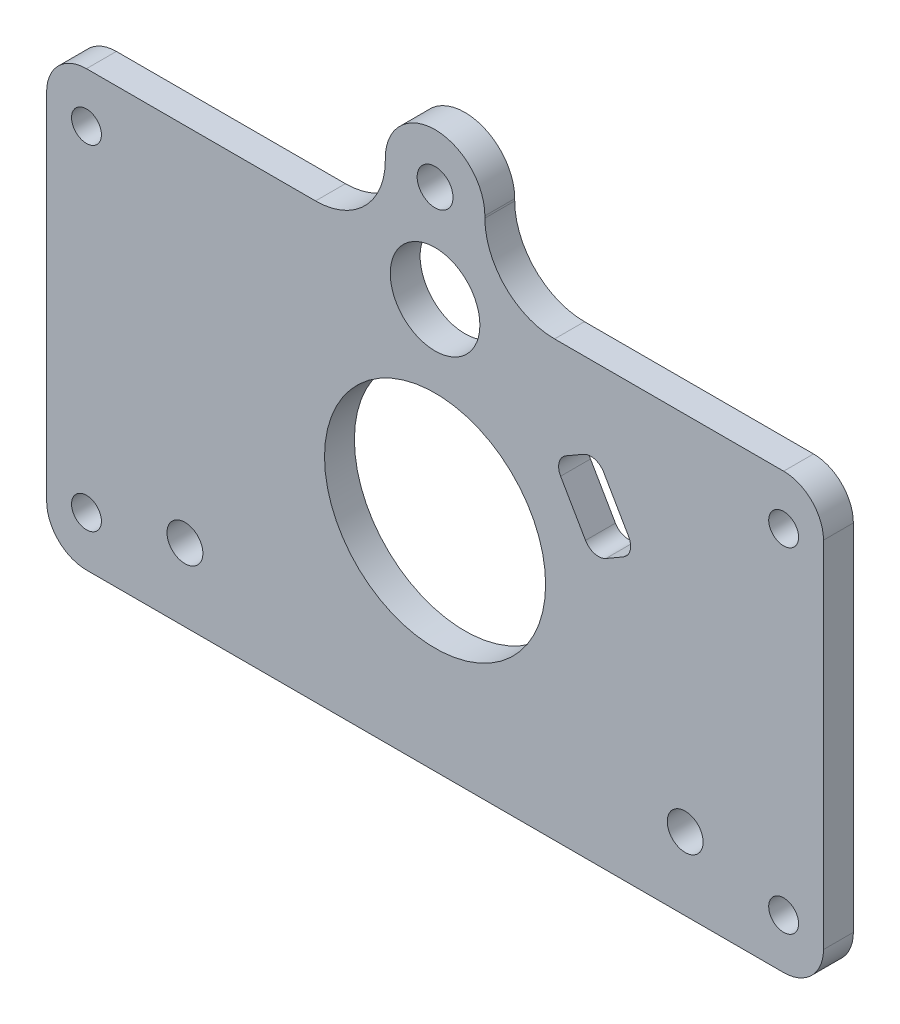
ISO-10303-21;
HEADER;
FILE_DESCRIPTION(('STEP AP214'),'2;1');
FILE_NAME('part.step','',(''),(''),'','','');
FILE_SCHEMA(('AUTOMOTIVE_DESIGN { 1 0 10303 214 1 1 1 1 }'));
ENDSEC;
DATA;
#1=APPLICATION_CONTEXT('core data for automotive mechanical design processes');
#2=APPLICATION_PROTOCOL_DEFINITION('international standard','automotive_design',2000,#1);
#3=PRODUCT_CONTEXT('',#1,'mechanical');
#4=PRODUCT('Part','Part','',(#3));
#5=PRODUCT_RELATED_PRODUCT_CATEGORY('part','',(#4));
#6=PRODUCT_DEFINITION_FORMATION('','',#4);
#7=PRODUCT_DEFINITION_CONTEXT('part definition',#1,'design');
#8=PRODUCT_DEFINITION('design','',#6,#7);
#9=PRODUCT_DEFINITION_SHAPE('','',#8);
#10=(LENGTH_UNIT() NAMED_UNIT(*) SI_UNIT(.MILLI.,.METRE.));
#11=(NAMED_UNIT(*) PLANE_ANGLE_UNIT() SI_UNIT($,.RADIAN.));
#12=(NAMED_UNIT(*) SI_UNIT($,.STERADIAN.) SOLID_ANGLE_UNIT());
#13=UNCERTAINTY_MEASURE_WITH_UNIT(LENGTH_MEASURE(1.E-05),#10,'distance_accuracy_value','');
#14=(GEOMETRIC_REPRESENTATION_CONTEXT(3) GLOBAL_UNCERTAINTY_ASSIGNED_CONTEXT((#13)) GLOBAL_UNIT_ASSIGNED_CONTEXT((#10,
#11,#12)) REPRESENTATION_CONTEXT('',''));
#15=CARTESIAN_POINT('',(0.,0.,0.));
#16=DIRECTION('',(0.,0.,1.));
#17=DIRECTION('',(1.,0.,0.));
#18=AXIS2_PLACEMENT_3D('',#15,#16,#17);
#19=CARTESIAN_POINT('',(0.,29.,3.));
#20=DIRECTION('',(0.,0.,-1.));
#21=DIRECTION('',(-1.,0.,0.));
#22=AXIS2_PLACEMENT_3D('',#19,#20,#21);
#23=PLANE('',#22);
#24=CARTESIAN_POINT('',(-35.,-16.8,3.));
#25=DIRECTION('',(0.,0.,1.));
#26=DIRECTION('',(1.,0.,0.));
#27=AXIS2_PLACEMENT_3D('',#24,#25,#26);
#28=CIRCLE('',#27,1.5);
#29=CARTESIAN_POINT('',(-33.5,-16.8,3.));
#30=VERTEX_POINT('',#29);
#31=EDGE_CURVE('E389',#30,#30,#28,.T.);
#32=ORIENTED_EDGE('',*,*,#31,.F.);
#33=EDGE_LOOP('',(#32));
#34=FACE_BOUND('',#33,.T.);
#35=CARTESIAN_POINT('',(-35.,16.8,3.));
#36=DIRECTION('',(0.,0.,1.));
#37=DIRECTION('',(1.,0.,0.));
#38=AXIS2_PLACEMENT_3D('',#35,#36,#37);
#39=CIRCLE('',#38,1.5);
#40=CARTESIAN_POINT('',(-33.5,16.8,3.));
#41=VERTEX_POINT('',#40);
#42=EDGE_CURVE('E385',#41,#41,#39,.T.);
#43=ORIENTED_EDGE('',*,*,#42,.F.);
#44=EDGE_LOOP('',(#43));
#45=FACE_BOUND('',#44,.T.);
#46=CARTESIAN_POINT('',(35.,-16.8,3.));
#47=DIRECTION('',(0.,0.,1.));
#48=DIRECTION('',(1.,0.,0.));
#49=AXIS2_PLACEMENT_3D('',#46,#47,#48);
#50=CIRCLE('',#49,1.5);
#51=CARTESIAN_POINT('',(36.5,-16.8,3.));
#52=VERTEX_POINT('',#51);
#53=EDGE_CURVE('E376',#52,#52,#50,.T.);
#54=ORIENTED_EDGE('',*,*,#53,.F.);
#55=EDGE_LOOP('',(#54));
#56=FACE_BOUND('',#55,.T.);
#57=CARTESIAN_POINT('',(35.,16.8,3.));
#58=DIRECTION('',(0.,0.,1.));
#59=DIRECTION('',(1.,0.,0.));
#60=AXIS2_PLACEMENT_3D('',#57,#58,#59);
#61=CIRCLE('',#60,1.5);
#62=CARTESIAN_POINT('',(36.5,16.8,3.));
#63=VERTEX_POINT('',#62);
#64=EDGE_CURVE('E367',#63,#63,#61,.T.);
#65=ORIENTED_EDGE('',*,*,#64,.F.);
#66=EDGE_LOOP('',(#65));
#67=FACE_BOUND('',#66,.T.);
#68=CARTESIAN_POINT('',(0.,0.,3.));
#69=DIRECTION('',(0.,0.,1.));
#70=DIRECTION('',(1.,0.,0.));
#71=AXIS2_PLACEMENT_3D('',#68,#69,#70);
#72=CIRCLE('',#71,11.1);
#73=CARTESIAN_POINT('',(11.1,0.,3.));
#74=VERTEX_POINT('',#73);
#75=EDGE_CURVE('E365',#74,#74,#72,.T.);
#76=ORIENTED_EDGE('',*,*,#75,.F.);
#77=EDGE_LOOP('',(#76));
#78=FACE_BOUND('',#77,.T.);
#79=CARTESIAN_POINT('',(0.,19.25,3.));
#80=DIRECTION('',(0.,0.,1.));
#81=DIRECTION('',(1.,0.,0.));
#82=AXIS2_PLACEMENT_3D('',#79,#80,#81);
#83=CIRCLE('',#82,4.5);
#84=CARTESIAN_POINT('',(4.5,19.25,3.));
#85=VERTEX_POINT('',#84);
#86=EDGE_CURVE('E227',#85,#85,#83,.T.);
#87=ORIENTED_EDGE('',*,*,#86,.F.);
#88=EDGE_LOOP('',(#87));
#89=FACE_BOUND('',#88,.T.);
#90=DIRECTION('',(0.,1.,0.));
#91=VECTOR('',#90,1.);
#92=CARTESIAN_POINT('',(38.9999999999998,-21.8000000000003,3.));
#93=LINE('',#92,#91);
#94=CARTESIAN_POINT('',(38.9999999999998,-17.8000000000003,3.));
#95=VERTEX_POINT('',#94);
#96=CARTESIAN_POINT('',(38.9999999999998,17.8000000000003,3.));
#97=VERTEX_POINT('',#96);
#98=EDGE_CURVE('E353',#95,#97,#93,.T.);
#99=ORIENTED_EDGE('',*,*,#98,.T.);
#100=CARTESIAN_POINT('',(34.9999999999998,17.8000000000003,3.));
#101=DIRECTION('',(0.,0.,-1.));
#102=DIRECTION('',(-1.,0.,0.));
#103=AXIS2_PLACEMENT_3D('',#100,#101,#102);
#104=CIRCLE('',#103,4.);
#105=CARTESIAN_POINT('',(34.9999999999998,21.8000000000003,3.));
#106=VERTEX_POINT('',#105);
#107=EDGE_CURVE('E318',#97,#106,#104,.F.);
#108=ORIENTED_EDGE('',*,*,#107,.T.);
#109=DIRECTION('',(-1.,0.,0.));
#110=VECTOR('',#109,1.);
#111=CARTESIAN_POINT('',(5.,21.8000000000003,3.));
#112=LINE('',#111,#110);
#113=CARTESIAN_POINT('',(12.,21.8000000000003,3.));
#114=VERTEX_POINT('',#113);
#115=EDGE_CURVE('E205',#106,#114,#112,.T.);
#116=ORIENTED_EDGE('',*,*,#115,.T.);
#117=CARTESIAN_POINT('',(12.,28.8000000000003,3.));
#118=DIRECTION('',(0.,0.,-1.));
#119=DIRECTION('',(-1.,0.,0.));
#120=AXIS2_PLACEMENT_3D('',#117,#118,#119);
#121=CIRCLE('',#120,7.);
#122=CARTESIAN_POINT('',(5.,28.8000000000003,3.));
#123=VERTEX_POINT('',#122);
#124=EDGE_CURVE('E196',#114,#123,#121,.T.);
#125=ORIENTED_EDGE('',*,*,#124,.T.);
#126=DIRECTION('',(0.,1.,0.));
#127=VECTOR('',#126,1.);
#128=CARTESIAN_POINT('',(5.,29.,3.));
#129=LINE('',#128,#127);
#130=CARTESIAN_POINT('',(5.,29.,3.));
#131=VERTEX_POINT('',#130);
#132=EDGE_CURVE('E186',#123,#131,#129,.T.);
#133=ORIENTED_EDGE('',*,*,#132,.T.);
#134=CARTESIAN_POINT('',(0.,29.,3.));
#135=DIRECTION('',(0.,0.,1.));
#136=DIRECTION('',(-1.,0.,0.));
#137=AXIS2_PLACEMENT_3D('',#134,#135,#136);
#138=CIRCLE('',#137,5.);
#139=CARTESIAN_POINT('',(-5.,29.,3.));
#140=VERTEX_POINT('',#139);
#141=EDGE_CURVE('E195',#131,#140,#138,.T.);
#142=ORIENTED_EDGE('',*,*,#141,.T.);
#143=DIRECTION('',(0.,-1.,0.));
#144=VECTOR('',#143,1.);
#145=CARTESIAN_POINT('',(-5.,21.8000000000003,3.));
#146=LINE('',#145,#144);
#147=CARTESIAN_POINT('',(-5.,28.8000000000003,3.));
#148=VERTEX_POINT('',#147);
#149=EDGE_CURVE('E220',#140,#148,#146,.T.);
#150=ORIENTED_EDGE('',*,*,#149,.T.);
#151=CARTESIAN_POINT('',(-12.,28.8000000000003,3.));
#152=DIRECTION('',(0.,0.,-1.));
#153=DIRECTION('',(-1.,0.,0.));
#154=AXIS2_PLACEMENT_3D('',#151,#152,#153);
#155=CIRCLE('',#154,7.);
#156=CARTESIAN_POINT('',(-12.,21.8000000000003,3.));
#157=VERTEX_POINT('',#156);
#158=EDGE_CURVE('E292',#148,#157,#155,.T.);
#159=ORIENTED_EDGE('',*,*,#158,.T.);
#160=DIRECTION('',(-1.,0.,0.));
#161=VECTOR('',#160,1.);
#162=CARTESIAN_POINT('',(-38.9999999999998,21.8000000000003,3.));
#163=LINE('',#162,#161);
#164=CARTESIAN_POINT('',(-34.9999999999998,21.8000000000003,3.));
#165=VERTEX_POINT('',#164);
#166=EDGE_CURVE('E244',#157,#165,#163,.T.);
#167=ORIENTED_EDGE('',*,*,#166,.T.);
#168=CARTESIAN_POINT('',(-34.9999999999998,17.8000000000003,3.));
#169=DIRECTION('',(0.,0.,-1.));
#170=DIRECTION('',(-1.,0.,0.));
#171=AXIS2_PLACEMENT_3D('',#168,#169,#170);
#172=CIRCLE('',#171,4.);
#173=CARTESIAN_POINT('',(-38.9999999999998,17.8000000000003,3.));
#174=VERTEX_POINT('',#173);
#175=EDGE_CURVE('E311',#165,#174,#172,.F.);
#176=ORIENTED_EDGE('',*,*,#175,.T.);
#177=DIRECTION('',(0.,-1.,0.));
#178=VECTOR('',#177,1.);
#179=CARTESIAN_POINT('',(-38.9999999999998,-21.8000000000003,3.));
#180=LINE('',#179,#178);
#181=CARTESIAN_POINT('',(-38.9999999999998,-17.8000000000003,3.));
#182=VERTEX_POINT('',#181);
#183=EDGE_CURVE('E329',#174,#182,#180,.T.);
#184=ORIENTED_EDGE('',*,*,#183,.T.);
#185=CARTESIAN_POINT('',(-34.9999999999998,-17.8000000000003,3.));
#186=DIRECTION('',(0.,0.,-1.));
#187=DIRECTION('',(-1.,0.,0.));
#188=AXIS2_PLACEMENT_3D('',#185,#186,#187);
#189=CIRCLE('',#188,4.);
#190=CARTESIAN_POINT('',(-34.9999999999998,-21.8000000000003,3.));
#191=VERTEX_POINT('',#190);
#192=EDGE_CURVE('E65',#182,#191,#189,.F.);
#193=ORIENTED_EDGE('',*,*,#192,.T.);
#194=DIRECTION('',(1.,0.,0.));
#195=VECTOR('',#194,1.);
#196=CARTESIAN_POINT('',(-38.9999999999998,-21.8000000000003,3.));
#197=LINE('',#196,#195);
#198=CARTESIAN_POINT('',(34.9999999999998,-21.8000000000003,3.));
#199=VERTEX_POINT('',#198);
#200=EDGE_CURVE('E337',#191,#199,#197,.T.);
#201=ORIENTED_EDGE('',*,*,#200,.T.);
#202=CARTESIAN_POINT('',(34.9999999999998,-17.8000000000003,3.));
#203=DIRECTION('',(0.,0.,-1.));
#204=DIRECTION('',(-1.,0.,0.));
#205=AXIS2_PLACEMENT_3D('',#202,#203,#204);
#206=CIRCLE('',#205,4.);
#207=EDGE_CURVE('E316',#199,#95,#206,.F.);
#208=ORIENTED_EDGE('',*,*,#207,.T.);
#209=EDGE_LOOP('',(#99,#108,#116,#125,#133,#142,#150,#159,#167,#176,#184,#193,#201,#208));
#210=FACE_BOUND('',#209,.T.);
#211=DIRECTION('',(-0.866025403784441,-0.499999999999995,0.));
#212=VECTOR('',#211,1.);
#213=CARTESIAN_POINT('',(16.1865334794736,13.9641016151378,3.));
#214=LINE('',#213,#212);
#215=CARTESIAN_POINT('',(14.8874953737969,13.2141016151378,3.));
#216=VERTEX_POINT('',#215);
#217=CARTESIAN_POINT('',(13.155444566228,12.2141016151378,3.));
#218=VERTEX_POINT('',#217);
#219=EDGE_CURVE('E400',#216,#218,#214,.T.);
#220=ORIENTED_EDGE('',*,*,#219,.F.);
#221=CARTESIAN_POINT('',(15.6374953737969,11.9150635094612,3.));
#222=DIRECTION('',(0.,0.,-1.));
#223=DIRECTION('',(-1.,0.,0.));
#224=AXIS2_PLACEMENT_3D('',#221,#222,#223);
#225=CIRCLE('',#224,1.5);
#226=CARTESIAN_POINT('',(16.9365334794736,12.6650635094612,3.));
#227=VERTEX_POINT('',#226);
#228=EDGE_CURVE('E267',#216,#227,#225,.T.);
#229=ORIENTED_EDGE('',*,*,#228,.T.);
#230=DIRECTION('',(-0.499999999999995,0.866025403784442,0.));
#231=VECTOR('',#230,1.);
#232=CARTESIAN_POINT('',(20.1865334794735,7.03589838486229,3.));
#233=LINE('',#232,#231);
#234=CARTESIAN_POINT('',(19.4365334794735,8.33493649053895,3.));
#235=VERTEX_POINT('',#234);
#236=EDGE_CURVE('E391',#235,#227,#233,.T.);
#237=ORIENTED_EDGE('',*,*,#236,.F.);
#238=CARTESIAN_POINT('',(18.1374953737969,7.58493649053896,3.));
#239=DIRECTION('',(0.,0.,-1.));
#240=DIRECTION('',(-1.,0.,0.));
#241=AXIS2_PLACEMENT_3D('',#238,#239,#240);
#242=CIRCLE('',#241,1.5);
#243=CARTESIAN_POINT('',(18.8874953737969,6.2858983848623,3.));
#244=VERTEX_POINT('',#243);
#245=EDGE_CURVE('E264',#235,#244,#242,.T.);
#246=ORIENTED_EDGE('',*,*,#245,.T.);
#247=DIRECTION('',(0.866025403784441,0.499999999999995,0.));
#248=VECTOR('',#247,1.);
#249=CARTESIAN_POINT('',(15.8564064605513,4.53589838486232,3.));
#250=LINE('',#249,#248);
#251=CARTESIAN_POINT('',(17.155444566228,5.28589838486231,3.));
#252=VERTEX_POINT('',#251);
#253=EDGE_CURVE('E414',#252,#244,#250,.T.);
#254=ORIENTED_EDGE('',*,*,#253,.F.);
#255=CARTESIAN_POINT('',(16.405444566228,6.58493649053897,3.));
#256=DIRECTION('',(0.,0.,-1.));
#257=DIRECTION('',(-1.,0.,0.));
#258=AXIS2_PLACEMENT_3D('',#255,#256,#257);
#259=CIRCLE('',#258,1.5);
#260=CARTESIAN_POINT('',(15.1064064605513,5.83493649053898,3.));
#261=VERTEX_POINT('',#260);
#262=EDGE_CURVE('E280',#252,#261,#259,.T.);
#263=ORIENTED_EDGE('',*,*,#262,.T.);
#264=DIRECTION('',(0.499999999999995,-0.866025403784442,0.));
#265=VECTOR('',#264,1.);
#266=CARTESIAN_POINT('',(11.8564064605514,11.4641016151378,3.));
#267=LINE('',#266,#265);
#268=CARTESIAN_POINT('',(12.6064064605514,10.1650635094612,3.));
#269=VERTEX_POINT('',#268);
#270=EDGE_CURVE('E418',#269,#261,#267,.T.);
#271=ORIENTED_EDGE('',*,*,#270,.F.);
#272=CARTESIAN_POINT('',(13.905444566228,10.9150635094612,3.));
#273=DIRECTION('',(0.,0.,-1.));
#274=DIRECTION('',(-1.,0.,0.));
#275=AXIS2_PLACEMENT_3D('',#272,#273,#274);
#276=CIRCLE('',#275,1.5);
#277=EDGE_CURVE('E272',#269,#218,#276,.T.);
#278=ORIENTED_EDGE('',*,*,#277,.T.);
#279=EDGE_LOOP('',(#220,#229,#237,#246,#254,#263,#271,#278));
#280=FACE_BOUND('',#279,.T.);
#281=CARTESIAN_POINT('',(0.,29.,3.));
#282=DIRECTION('',(0.,0.,1.));
#283=DIRECTION('',(1.,0.,0.));
#284=AXIS2_PLACEMENT_3D('',#281,#282,#283);
#285=CIRCLE('',#284,1.8);
#286=CARTESIAN_POINT('',(1.8,29.,3.));
#287=VERTEX_POINT('',#286);
#288=EDGE_CURVE('E408',#287,#287,#285,.T.);
#289=ORIENTED_EDGE('',*,*,#288,.F.);
#290=EDGE_LOOP('',(#289));
#291=FACE_BOUND('',#290,.T.);
#292=CARTESIAN_POINT('',(25.1147367097487,-14.5000000000001,3.));
#293=DIRECTION('',(0.,0.,1.));
#294=DIRECTION('',(1.,0.,0.));
#295=AXIS2_PLACEMENT_3D('',#292,#293,#294);
#296=CIRCLE('',#295,1.8);
#297=CARTESIAN_POINT('',(26.9147367097487,-14.5000000000001,3.));
#298=VERTEX_POINT('',#297);
#299=EDGE_CURVE('E424',#298,#298,#296,.T.);
#300=ORIENTED_EDGE('',*,*,#299,.F.);
#301=EDGE_LOOP('',(#300));
#302=FACE_BOUND('',#301,.T.);
#303=CARTESIAN_POINT('',(-25.1147367097487,-14.5000000000001,3.));
#304=DIRECTION('',(0.,0.,1.));
#305=DIRECTION('',(1.,0.,0.));
#306=AXIS2_PLACEMENT_3D('',#303,#304,#305);
#307=CIRCLE('',#306,1.8);
#308=CARTESIAN_POINT('',(-23.3147367097487,-14.5000000000001,3.));
#309=VERTEX_POINT('',#308);
#310=EDGE_CURVE('E429',#309,#309,#307,.T.);
#311=ORIENTED_EDGE('',*,*,#310,.F.);
#312=EDGE_LOOP('',(#311));
#313=FACE_BOUND('',#312,.T.);
#314=ADVANCED_FACE('F41',(#34,#45,#56,#67,#78,#89,#210,#280,#291,#302,#313),#23,.F.);
#315=CARTESIAN_POINT('',(0.,29.,0.));
#316=DIRECTION('',(0.,0.,-1.));
#317=DIRECTION('',(-1.,0.,0.));
#318=AXIS2_PLACEMENT_3D('',#315,#316,#317);
#319=PLANE('',#318);
#320=CARTESIAN_POINT('',(25.1147367097487,-14.5000000000001,0.));
#321=DIRECTION('',(0.,0.,1.));
#322=DIRECTION('',(1.,0.,0.));
#323=AXIS2_PLACEMENT_3D('',#320,#321,#322);
#324=CIRCLE('',#323,1.8);
#325=CARTESIAN_POINT('',(26.9147367097487,-14.5000000000001,0.));
#326=VERTEX_POINT('',#325);
#327=EDGE_CURVE('E430',#326,#326,#324,.T.);
#328=ORIENTED_EDGE('',*,*,#327,.T.);
#329=EDGE_LOOP('',(#328));
#330=FACE_BOUND('',#329,.T.);
#331=DIRECTION('',(0.866025403784441,0.499999999999995,0.));
#332=VECTOR('',#331,1.);
#333=CARTESIAN_POINT('',(15.8564064605513,4.53589838486232,0.));
#334=LINE('',#333,#332);
#335=CARTESIAN_POINT('',(17.155444566228,5.28589838486231,0.));
#336=VERTEX_POINT('',#335);
#337=CARTESIAN_POINT('',(18.8874953737969,6.2858983848623,0.));
#338=VERTEX_POINT('',#337);
#339=EDGE_CURVE('E402',#336,#338,#334,.T.);
#340=ORIENTED_EDGE('',*,*,#339,.T.);
#341=CARTESIAN_POINT('',(18.1374953737969,7.58493649053896,0.));
#342=DIRECTION('',(0.,0.,-1.));
#343=DIRECTION('',(-1.,0.,0.));
#344=AXIS2_PLACEMENT_3D('',#341,#342,#343);
#345=CIRCLE('',#344,1.5);
#346=CARTESIAN_POINT('',(19.4365334794735,8.33493649053895,0.));
#347=VERTEX_POINT('',#346);
#348=EDGE_CURVE('E263',#338,#347,#345,.F.);
#349=ORIENTED_EDGE('',*,*,#348,.T.);
#350=DIRECTION('',(-0.499999999999995,0.866025403784442,0.));
#351=VECTOR('',#350,1.);
#352=CARTESIAN_POINT('',(20.1865334794735,7.03589838486229,0.));
#353=LINE('',#352,#351);
#354=CARTESIAN_POINT('',(16.9365334794736,12.6650635094612,0.));
#355=VERTEX_POINT('',#354);
#356=EDGE_CURVE('E397',#347,#355,#353,.T.);
#357=ORIENTED_EDGE('',*,*,#356,.T.);
#358=CARTESIAN_POINT('',(15.6374953737969,11.9150635094612,0.));
#359=DIRECTION('',(0.,0.,-1.));
#360=DIRECTION('',(-1.,0.,0.));
#361=AXIS2_PLACEMENT_3D('',#358,#359,#360);
#362=CIRCLE('',#361,1.5);
#363=CARTESIAN_POINT('',(14.8874953737969,13.2141016151378,0.));
#364=VERTEX_POINT('',#363);
#365=EDGE_CURVE('E270',#355,#364,#362,.F.);
#366=ORIENTED_EDGE('',*,*,#365,.T.);
#367=DIRECTION('',(-0.866025403784441,-0.499999999999995,0.));
#368=VECTOR('',#367,1.);
#369=CARTESIAN_POINT('',(16.1865334794736,13.9641016151378,0.));
#370=LINE('',#369,#368);
#371=CARTESIAN_POINT('',(13.155444566228,12.2141016151378,0.));
#372=VERTEX_POINT('',#371);
#373=EDGE_CURVE('E409',#364,#372,#370,.T.);
#374=ORIENTED_EDGE('',*,*,#373,.T.);
#375=CARTESIAN_POINT('',(13.905444566228,10.9150635094612,0.));
#376=DIRECTION('',(0.,0.,-1.));
#377=DIRECTION('',(-1.,0.,0.));
#378=AXIS2_PLACEMENT_3D('',#375,#376,#377);
#379=CIRCLE('',#378,1.5);
#380=CARTESIAN_POINT('',(12.6064064605514,10.1650635094612,0.));
#381=VERTEX_POINT('',#380);
#382=EDGE_CURVE('E271',#372,#381,#379,.F.);
#383=ORIENTED_EDGE('',*,*,#382,.T.);
#384=DIRECTION('',(0.499999999999995,-0.866025403784442,0.));
#385=VECTOR('',#384,1.);
#386=CARTESIAN_POINT('',(11.8564064605514,11.4641016151378,0.));
#387=LINE('',#386,#385);
#388=CARTESIAN_POINT('',(15.1064064605513,5.83493649053898,0.));
#389=VERTEX_POINT('',#388);
#390=EDGE_CURVE('E404',#381,#389,#387,.T.);
#391=ORIENTED_EDGE('',*,*,#390,.T.);
#392=CARTESIAN_POINT('',(16.405444566228,6.58493649053897,0.));
#393=DIRECTION('',(0.,0.,-1.));
#394=DIRECTION('',(-1.,0.,0.));
#395=AXIS2_PLACEMENT_3D('',#392,#393,#394);
#396=CIRCLE('',#395,1.5);
#397=EDGE_CURVE('E274',#389,#336,#396,.F.);
#398=ORIENTED_EDGE('',*,*,#397,.T.);
#399=EDGE_LOOP('',(#340,#349,#357,#366,#374,#383,#391,#398));
#400=FACE_BOUND('',#399,.T.);
#401=CARTESIAN_POINT('',(-35.,-16.8,0.));
#402=DIRECTION('',(0.,0.,1.));
#403=DIRECTION('',(1.,0.,0.));
#404=AXIS2_PLACEMENT_3D('',#401,#402,#403);
#405=CIRCLE('',#404,1.5);
#406=CARTESIAN_POINT('',(-33.5,-16.8,0.));
#407=VERTEX_POINT('',#406);
#408=EDGE_CURVE('E392',#407,#407,#405,.T.);
#409=ORIENTED_EDGE('',*,*,#408,.T.);
#410=EDGE_LOOP('',(#409));
#411=FACE_BOUND('',#410,.T.);
#412=CARTESIAN_POINT('',(35.,-16.8,0.));
#413=DIRECTION('',(0.,0.,1.));
#414=DIRECTION('',(1.,0.,0.));
#415=AXIS2_PLACEMENT_3D('',#412,#413,#414);
#416=CIRCLE('',#415,1.5);
#417=CARTESIAN_POINT('',(36.5,-16.8,0.));
#418=VERTEX_POINT('',#417);
#419=EDGE_CURVE('E377',#418,#418,#416,.T.);
#420=ORIENTED_EDGE('',*,*,#419,.T.);
#421=EDGE_LOOP('',(#420));
#422=FACE_BOUND('',#421,.T.);
#423=CARTESIAN_POINT('',(0.,0.,0.));
#424=DIRECTION('',(0.,0.,1.));
#425=DIRECTION('',(1.,0.,0.));
#426=AXIS2_PLACEMENT_3D('',#423,#424,#425);
#427=CIRCLE('',#426,11.1);
#428=CARTESIAN_POINT('',(11.1,0.,0.));
#429=VERTEX_POINT('',#428);
#430=EDGE_CURVE('E370',#429,#429,#427,.T.);
#431=ORIENTED_EDGE('',*,*,#430,.T.);
#432=EDGE_LOOP('',(#431));
#433=FACE_BOUND('',#432,.T.);
#434=DIRECTION('',(-1.,0.,0.));
#435=VECTOR('',#434,1.);
#436=CARTESIAN_POINT('',(5.,21.8000000000003,0.));
#437=LINE('',#436,#435);
#438=CARTESIAN_POINT('',(34.9999999999998,21.8000000000003,0.));
#439=VERTEX_POINT('',#438);
#440=CARTESIAN_POINT('',(12.,21.8000000000003,0.));
#441=VERTEX_POINT('',#440);
#442=EDGE_CURVE('E233',#439,#441,#437,.T.);
#443=ORIENTED_EDGE('',*,*,#442,.F.);
#444=CARTESIAN_POINT('',(34.9999999999998,17.8000000000003,0.));
#445=DIRECTION('',(0.,0.,-1.));
#446=DIRECTION('',(-1.,0.,0.));
#447=AXIS2_PLACEMENT_3D('',#444,#445,#446);
#448=CIRCLE('',#447,4.);
#449=CARTESIAN_POINT('',(38.9999999999998,17.8000000000003,0.));
#450=VERTEX_POINT('',#449);
#451=EDGE_CURVE('E308',#439,#450,#448,.T.);
#452=ORIENTED_EDGE('',*,*,#451,.T.);
#453=DIRECTION('',(0.,1.,0.));
#454=VECTOR('',#453,1.);
#455=CARTESIAN_POINT('',(38.9999999999998,-21.8000000000003,0.));
#456=LINE('',#455,#454);
#457=CARTESIAN_POINT('',(38.9999999999998,-17.8000000000003,0.));
#458=VERTEX_POINT('',#457);
#459=EDGE_CURVE('E231',#458,#450,#456,.T.);
#460=ORIENTED_EDGE('',*,*,#459,.F.);
#461=CARTESIAN_POINT('',(34.9999999999998,-17.8000000000003,0.));
#462=DIRECTION('',(0.,0.,-1.));
#463=DIRECTION('',(-1.,0.,0.));
#464=AXIS2_PLACEMENT_3D('',#461,#462,#463);
#465=CIRCLE('',#464,4.);
#466=CARTESIAN_POINT('',(34.9999999999998,-21.8000000000003,0.));
#467=VERTEX_POINT('',#466);
#468=EDGE_CURVE('E303',#458,#467,#465,.T.);
#469=ORIENTED_EDGE('',*,*,#468,.T.);
#470=DIRECTION('',(1.,0.,0.));
#471=VECTOR('',#470,1.);
#472=CARTESIAN_POINT('',(-38.9999999999998,-21.8000000000003,0.));
#473=LINE('',#472,#471);
#474=CARTESIAN_POINT('',(-34.9999999999998,-21.8000000000003,0.));
#475=VERTEX_POINT('',#474);
#476=EDGE_CURVE('E226',#475,#467,#473,.T.);
#477=ORIENTED_EDGE('',*,*,#476,.F.);
#478=CARTESIAN_POINT('',(-34.9999999999998,-17.8000000000003,0.));
#479=DIRECTION('',(0.,0.,-1.));
#480=DIRECTION('',(-1.,0.,0.));
#481=AXIS2_PLACEMENT_3D('',#478,#479,#480);
#482=CIRCLE('',#481,4.);
#483=CARTESIAN_POINT('',(-38.9999999999998,-17.8000000000003,0.));
#484=VERTEX_POINT('',#483);
#485=EDGE_CURVE('E302',#475,#484,#482,.T.);
#486=ORIENTED_EDGE('',*,*,#485,.T.);
#487=DIRECTION('',(0.,-1.,0.));
#488=VECTOR('',#487,1.);
#489=CARTESIAN_POINT('',(-38.9999999999998,-21.8000000000003,0.));
#490=LINE('',#489,#488);
#491=CARTESIAN_POINT('',(-38.9999999999998,17.8000000000003,0.));
#492=VERTEX_POINT('',#491);
#493=EDGE_CURVE('E223',#492,#484,#490,.T.);
#494=ORIENTED_EDGE('',*,*,#493,.F.);
#495=CARTESIAN_POINT('',(-34.9999999999998,17.8000000000003,0.));
#496=DIRECTION('',(0.,0.,-1.));
#497=DIRECTION('',(-1.,0.,0.));
#498=AXIS2_PLACEMENT_3D('',#495,#496,#497);
#499=CIRCLE('',#498,4.);
#500=CARTESIAN_POINT('',(-34.9999999999998,21.8000000000003,0.));
#501=VERTEX_POINT('',#500);
#502=EDGE_CURVE('E298',#492,#501,#499,.T.);
#503=ORIENTED_EDGE('',*,*,#502,.T.);
#504=DIRECTION('',(-1.,0.,0.));
#505=VECTOR('',#504,1.);
#506=CARTESIAN_POINT('',(-38.9999999999998,21.8000000000003,0.));
#507=LINE('',#506,#505);
#508=CARTESIAN_POINT('',(-12.,21.8000000000003,0.));
#509=VERTEX_POINT('',#508);
#510=EDGE_CURVE('E225',#509,#501,#507,.T.);
#511=ORIENTED_EDGE('',*,*,#510,.F.);
#512=CARTESIAN_POINT('',(-12.,28.8000000000003,0.));
#513=DIRECTION('',(0.,0.,-1.));
#514=DIRECTION('',(-1.,0.,0.));
#515=AXIS2_PLACEMENT_3D('',#512,#513,#514);
#516=CIRCLE('',#515,7.);
#517=CARTESIAN_POINT('',(-5.,28.8000000000003,0.));
#518=VERTEX_POINT('',#517);
#519=EDGE_CURVE('E288',#509,#518,#516,.F.);
#520=ORIENTED_EDGE('',*,*,#519,.T.);
#521=DIRECTION('',(0.,-1.,0.));
#522=VECTOR('',#521,1.);
#523=CARTESIAN_POINT('',(-5.,21.8000000000003,0.));
#524=LINE('',#523,#522);
#525=CARTESIAN_POINT('',(-5.,29.,0.));
#526=VERTEX_POINT('',#525);
#527=EDGE_CURVE('E239',#526,#518,#524,.T.);
#528=ORIENTED_EDGE('',*,*,#527,.F.);
#529=CARTESIAN_POINT('',(0.,29.,0.));
#530=DIRECTION('',(0.,0.,1.));
#531=DIRECTION('',(-1.,0.,0.));
#532=AXIS2_PLACEMENT_3D('',#529,#530,#531);
#533=CIRCLE('',#532,5.);
#534=CARTESIAN_POINT('',(5.,29.,0.));
#535=VERTEX_POINT('',#534);
#536=EDGE_CURVE('E240',#535,#526,#533,.T.);
#537=ORIENTED_EDGE('',*,*,#536,.F.);
#538=DIRECTION('',(0.,1.,0.));
#539=VECTOR('',#538,1.);
#540=CARTESIAN_POINT('',(5.,29.,0.));
#541=LINE('',#540,#539);
#542=CARTESIAN_POINT('',(5.,28.8000000000003,0.));
#543=VERTEX_POINT('',#542);
#544=EDGE_CURVE('E208',#543,#535,#541,.T.);
#545=ORIENTED_EDGE('',*,*,#544,.F.);
#546=CARTESIAN_POINT('',(12.,28.8000000000003,0.));
#547=DIRECTION('',(0.,0.,-1.));
#548=DIRECTION('',(-1.,0.,0.));
#549=AXIS2_PLACEMENT_3D('',#546,#547,#548);
#550=CIRCLE('',#549,7.);
#551=EDGE_CURVE('E291',#543,#441,#550,.F.);
#552=ORIENTED_EDGE('',*,*,#551,.T.);
#553=EDGE_LOOP('',(#443,#452,#460,#469,#477,#486,#494,#503,#511,#520,#528,#537,#545,#552));
#554=FACE_BOUND('',#553,.T.);
#555=CARTESIAN_POINT('',(0.,19.25,0.));
#556=DIRECTION('',(0.,0.,1.));
#557=DIRECTION('',(1.,0.,0.));
#558=AXIS2_PLACEMENT_3D('',#555,#556,#557);
#559=CIRCLE('',#558,4.5);
#560=CARTESIAN_POINT('',(4.5,19.25,0.));
#561=VERTEX_POINT('',#560);
#562=EDGE_CURVE('E363',#561,#561,#559,.T.);
#563=ORIENTED_EDGE('',*,*,#562,.T.);
#564=EDGE_LOOP('',(#563));
#565=FACE_BOUND('',#564,.T.);
#566=CARTESIAN_POINT('',(35.,16.8,0.));
#567=DIRECTION('',(0.,0.,1.));
#568=DIRECTION('',(1.,0.,0.));
#569=AXIS2_PLACEMENT_3D('',#566,#567,#568);
#570=CIRCLE('',#569,1.5);
#571=CARTESIAN_POINT('',(36.5,16.8,0.));
#572=VERTEX_POINT('',#571);
#573=EDGE_CURVE('E373',#572,#572,#570,.T.);
#574=ORIENTED_EDGE('',*,*,#573,.T.);
#575=EDGE_LOOP('',(#574));
#576=FACE_BOUND('',#575,.T.);
#577=CARTESIAN_POINT('',(-35.,16.8,0.));
#578=DIRECTION('',(0.,0.,1.));
#579=DIRECTION('',(1.,0.,0.));
#580=AXIS2_PLACEMENT_3D('',#577,#578,#579);
#581=CIRCLE('',#580,1.5);
#582=CARTESIAN_POINT('',(-33.5,16.8,0.));
#583=VERTEX_POINT('',#582);
#584=EDGE_CURVE('E384',#583,#583,#581,.T.);
#585=ORIENTED_EDGE('',*,*,#584,.T.);
#586=EDGE_LOOP('',(#585));
#587=FACE_BOUND('',#586,.T.);
#588=CARTESIAN_POINT('',(0.,29.,0.));
#589=DIRECTION('',(0.,0.,1.));
#590=DIRECTION('',(1.,0.,0.));
#591=AXIS2_PLACEMENT_3D('',#588,#589,#590);
#592=CIRCLE('',#591,1.8);
#593=CARTESIAN_POINT('',(1.8,29.,0.));
#594=VERTEX_POINT('',#593);
#595=EDGE_CURVE('E423',#594,#594,#592,.T.);
#596=ORIENTED_EDGE('',*,*,#595,.T.);
#597=EDGE_LOOP('',(#596));
#598=FACE_BOUND('',#597,.T.);
#599=CARTESIAN_POINT('',(-25.1147367097487,-14.5000000000001,0.));
#600=DIRECTION('',(0.,0.,1.));
#601=DIRECTION('',(1.,0.,0.));
#602=AXIS2_PLACEMENT_3D('',#599,#600,#601);
#603=CIRCLE('',#602,1.8);
#604=CARTESIAN_POINT('',(-23.3147367097487,-14.5000000000001,0.));
#605=VERTEX_POINT('',#604);
#606=EDGE_CURVE('E433',#605,#605,#603,.T.);
#607=ORIENTED_EDGE('',*,*,#606,.T.);
#608=EDGE_LOOP('',(#607));
#609=FACE_BOUND('',#608,.T.);
#610=ADVANCED_FACE('F343',(#330,#400,#411,#422,#433,#554,#565,#576,#587,#598,#609),#319,.T.);
#611=CARTESIAN_POINT('',(-38.9999999999998,21.8000000000003,3.));
#612=DIRECTION('',(0.,-1.,0.));
#613=DIRECTION('',(1.,0.,0.));
#614=AXIS2_PLACEMENT_3D('',#611,#612,#613);
#615=PLANE('',#614);
#616=ORIENTED_EDGE('',*,*,#510,.T.);
#617=DIRECTION('',(0.,0.,-1.));
#618=VECTOR('',#617,1.);
#619=CARTESIAN_POINT('',(-34.9999999999998,21.8000000000003,3.));
#620=LINE('',#619,#618);
#621=EDGE_CURVE('E11',#501,#165,#620,.F.);
#622=ORIENTED_EDGE('',*,*,#621,.T.);
#623=ORIENTED_EDGE('',*,*,#166,.F.);
#624=DIRECTION('',(0.,0.,-1.));
#625=VECTOR('',#624,1.);
#626=CARTESIAN_POINT('',(-12.,21.8000000000003,0.));
#627=LINE('',#626,#625);
#628=EDGE_CURVE('E276',#157,#509,#627,.T.);
#629=ORIENTED_EDGE('',*,*,#628,.T.);
#630=EDGE_LOOP('',(#616,#622,#623,#629));
#631=FACE_BOUND('',#630,.T.);
#632=ADVANCED_FACE('F446',(#631),#615,.F.);
#633=CARTESIAN_POINT('',(-38.9999999999998,-21.8000000000003,3.));
#634=DIRECTION('',(1.,0.,0.));
#635=DIRECTION('',(0.,1.,0.));
#636=AXIS2_PLACEMENT_3D('',#633,#634,#635);
#637=PLANE('',#636);
#638=ORIENTED_EDGE('',*,*,#493,.T.);
#639=DIRECTION('',(0.,0.,-1.));
#640=VECTOR('',#639,1.);
#641=CARTESIAN_POINT('',(-38.9999999999998,-17.8000000000003,3.));
#642=LINE('',#641,#640);
#643=EDGE_CURVE('E47',#484,#182,#642,.F.);
#644=ORIENTED_EDGE('',*,*,#643,.T.);
#645=ORIENTED_EDGE('',*,*,#183,.F.);
#646=DIRECTION('',(0.,0.,-1.));
#647=VECTOR('',#646,1.);
#648=CARTESIAN_POINT('',(-38.9999999999998,17.8000000000003,3.));
#649=LINE('',#648,#647);
#650=EDGE_CURVE('E322',#174,#492,#649,.T.);
#651=ORIENTED_EDGE('',*,*,#650,.T.);
#652=EDGE_LOOP('',(#638,#644,#645,#651));
#653=FACE_BOUND('',#652,.T.);
#654=ADVANCED_FACE('F328',(#653),#637,.F.);
#655=CARTESIAN_POINT('',(-38.9999999999998,-21.8000000000003,3.));
#656=DIRECTION('',(0.,1.,0.));
#657=DIRECTION('',(0.,0.,1.));
#658=AXIS2_PLACEMENT_3D('',#655,#656,#657);
#659=PLANE('',#658);
#660=ORIENTED_EDGE('',*,*,#476,.T.);
#661=DIRECTION('',(0.,0.,-1.));
#662=VECTOR('',#661,1.);
#663=CARTESIAN_POINT('',(34.9999999999998,-21.8000000000003,3.));
#664=LINE('',#663,#662);
#665=EDGE_CURVE('E57',#467,#199,#664,.F.);
#666=ORIENTED_EDGE('',*,*,#665,.T.);
#667=ORIENTED_EDGE('',*,*,#200,.F.);
#668=DIRECTION('',(0.,0.,-1.));
#669=VECTOR('',#668,1.);
#670=CARTESIAN_POINT('',(-34.9999999999998,-21.8000000000003,3.));
#671=LINE('',#670,#669);
#672=EDGE_CURVE('E319',#191,#475,#671,.T.);
#673=ORIENTED_EDGE('',*,*,#672,.T.);
#674=EDGE_LOOP('',(#660,#666,#667,#673));
#675=FACE_BOUND('',#674,.T.);
#676=ADVANCED_FACE('F341',(#675),#659,.F.);
#677=CARTESIAN_POINT('',(38.9999999999998,-21.8000000000003,3.));
#678=DIRECTION('',(-1.,0.,0.));
#679=DIRECTION('',(0.,0.,1.));
#680=AXIS2_PLACEMENT_3D('',#677,#678,#679);
#681=PLANE('',#680);
#682=ORIENTED_EDGE('',*,*,#459,.T.);
#683=DIRECTION('',(0.,0.,-1.));
#684=VECTOR('',#683,1.);
#685=CARTESIAN_POINT('',(38.9999999999998,17.8000000000003,3.));
#686=LINE('',#685,#684);
#687=EDGE_CURVE('E313',#450,#97,#686,.F.);
#688=ORIENTED_EDGE('',*,*,#687,.T.);
#689=ORIENTED_EDGE('',*,*,#98,.F.);
#690=DIRECTION('',(0.,0.,-1.));
#691=VECTOR('',#690,1.);
#692=CARTESIAN_POINT('',(38.9999999999998,-17.8000000000003,3.));
#693=LINE('',#692,#691);
#694=EDGE_CURVE('E306',#95,#458,#693,.T.);
#695=ORIENTED_EDGE('',*,*,#694,.T.);
#696=EDGE_LOOP('',(#682,#688,#689,#695));
#697=FACE_BOUND('',#696,.T.);
#698=ADVANCED_FACE('F355',(#697),#681,.F.);
#699=CARTESIAN_POINT('',(5.,21.8000000000003,3.));
#700=DIRECTION('',(0.,-1.,0.));
#701=DIRECTION('',(1.,0.,0.));
#702=AXIS2_PLACEMENT_3D('',#699,#700,#701);
#703=PLANE('',#702);
#704=ORIENTED_EDGE('',*,*,#115,.F.);
#705=DIRECTION('',(0.,0.,-1.));
#706=VECTOR('',#705,1.);
#707=CARTESIAN_POINT('',(34.9999999999998,21.8000000000003,3.));
#708=LINE('',#707,#706);
#709=EDGE_CURVE('E299',#106,#439,#708,.T.);
#710=ORIENTED_EDGE('',*,*,#709,.T.);
#711=ORIENTED_EDGE('',*,*,#442,.T.);
#712=DIRECTION('',(0.,0.,-1.));
#713=VECTOR('',#712,1.);
#714=CARTESIAN_POINT('',(12.,21.8000000000003,3.));
#715=LINE('',#714,#713);
#716=EDGE_CURVE('E286',#441,#114,#715,.F.);
#717=ORIENTED_EDGE('',*,*,#716,.T.);
#718=EDGE_LOOP('',(#704,#710,#711,#717));
#719=FACE_BOUND('',#718,.T.);
#720=ADVANCED_FACE('F466',(#719),#703,.F.);
#721=CARTESIAN_POINT('',(5.,29.,3.));
#722=DIRECTION('',(-1.,0.,0.));
#723=DIRECTION('',(0.,-1.,0.));
#724=AXIS2_PLACEMENT_3D('',#721,#722,#723);
#725=PLANE('',#724);
#726=ORIENTED_EDGE('',*,*,#132,.F.);
#727=DIRECTION('',(0.,0.,-1.));
#728=VECTOR('',#727,1.);
#729=CARTESIAN_POINT('',(5.,28.8000000000003,0.));
#730=LINE('',#729,#728);
#731=EDGE_CURVE('E281',#123,#543,#730,.T.);
#732=ORIENTED_EDGE('',*,*,#731,.T.);
#733=ORIENTED_EDGE('',*,*,#544,.T.);
#734=DIRECTION('',(0.,0.,-1.));
#735=VECTOR('',#734,1.);
#736=CARTESIAN_POINT('',(5.,29.,3.));
#737=LINE('',#736,#735);
#738=EDGE_CURVE('E202',#131,#535,#737,.T.);
#739=ORIENTED_EDGE('',*,*,#738,.F.);
#740=EDGE_LOOP('',(#726,#732,#733,#739));
#741=FACE_BOUND('',#740,.T.);
#742=ADVANCED_FACE('F206',(#741),#725,.F.);
#743=CARTESIAN_POINT('',(0.,29.,3.));
#744=DIRECTION('',(0.,0.,-1.));
#745=DIRECTION('',(-1.,0.,0.));
#746=AXIS2_PLACEMENT_3D('',#743,#744,#745);
#747=CYLINDRICAL_SURFACE('',#746,5.);
#748=ORIENTED_EDGE('',*,*,#536,.T.);
#749=DIRECTION('',(0.,0.,-1.));
#750=VECTOR('',#749,1.);
#751=CARTESIAN_POINT('',(-5.,29.,3.));
#752=LINE('',#751,#750);
#753=EDGE_CURVE('E215',#140,#526,#752,.T.);
#754=ORIENTED_EDGE('',*,*,#753,.F.);
#755=ORIENTED_EDGE('',*,*,#141,.F.);
#756=ORIENTED_EDGE('',*,*,#738,.T.);
#757=EDGE_LOOP('',(#748,#754,#755,#756));
#758=FACE_BOUND('',#757,.T.);
#759=ADVANCED_FACE('F212',(#758),#747,.T.);
#760=CARTESIAN_POINT('',(-5.,21.8000000000003,3.));
#761=DIRECTION('',(1.,0.,0.));
#762=DIRECTION('',(0.,0.,-1.));
#763=AXIS2_PLACEMENT_3D('',#760,#761,#762);
#764=PLANE('',#763);
#765=ORIENTED_EDGE('',*,*,#527,.T.);
#766=DIRECTION('',(0.,0.,-1.));
#767=VECTOR('',#766,1.);
#768=CARTESIAN_POINT('',(-5.,28.8000000000003,3.));
#769=LINE('',#768,#767);
#770=EDGE_CURVE('E284',#518,#148,#769,.F.);
#771=ORIENTED_EDGE('',*,*,#770,.T.);
#772=ORIENTED_EDGE('',*,*,#149,.F.);
#773=ORIENTED_EDGE('',*,*,#753,.T.);
#774=EDGE_LOOP('',(#765,#771,#772,#773));
#775=FACE_BOUND('',#774,.T.);
#776=ADVANCED_FACE('F456',(#775),#764,.F.);
#777=CARTESIAN_POINT('',(0.,19.25,3.));
#778=DIRECTION('',(0.,0.,-1.));
#779=DIRECTION('',(-1.,0.,0.));
#780=AXIS2_PLACEMENT_3D('',#777,#778,#779);
#781=CYLINDRICAL_SURFACE('',#780,4.5);
#782=ORIENTED_EDGE('',*,*,#86,.T.);
#783=EDGE_LOOP('',(#782));
#784=FACE_BOUND('',#783,.T.);
#785=ORIENTED_EDGE('',*,*,#562,.F.);
#786=EDGE_LOOP('',(#785));
#787=FACE_BOUND('',#786,.T.);
#788=ADVANCED_FACE('F455',(#784,#787),#781,.F.);
#789=CARTESIAN_POINT('',(0.,0.,3.));
#790=DIRECTION('',(0.,0.,-1.));
#791=DIRECTION('',(-1.,0.,0.));
#792=AXIS2_PLACEMENT_3D('',#789,#790,#791);
#793=CYLINDRICAL_SURFACE('',#792,11.1);
#794=ORIENTED_EDGE('',*,*,#75,.T.);
#795=EDGE_LOOP('',(#794));
#796=FACE_BOUND('',#795,.T.);
#797=ORIENTED_EDGE('',*,*,#430,.F.);
#798=EDGE_LOOP('',(#797));
#799=FACE_BOUND('',#798,.T.);
#800=ADVANCED_FACE('F683',(#796,#799),#793,.F.);
#801=CARTESIAN_POINT('',(35.,16.8,3.));
#802=DIRECTION('',(0.,0.,-1.));
#803=DIRECTION('',(-1.,0.,0.));
#804=AXIS2_PLACEMENT_3D('',#801,#802,#803);
#805=CYLINDRICAL_SURFACE('',#804,1.5);
#806=ORIENTED_EDGE('',*,*,#64,.T.);
#807=EDGE_LOOP('',(#806));
#808=FACE_BOUND('',#807,.T.);
#809=ORIENTED_EDGE('',*,*,#573,.F.);
#810=EDGE_LOOP('',(#809));
#811=FACE_BOUND('',#810,.T.);
#812=ADVANCED_FACE('F675',(#808,#811),#805,.F.);
#813=CARTESIAN_POINT('',(35.,-16.8,3.));
#814=DIRECTION('',(0.,0.,-1.));
#815=DIRECTION('',(-1.,0.,0.));
#816=AXIS2_PLACEMENT_3D('',#813,#814,#815);
#817=CYLINDRICAL_SURFACE('',#816,1.5);
#818=ORIENTED_EDGE('',*,*,#53,.T.);
#819=EDGE_LOOP('',(#818));
#820=FACE_BOUND('',#819,.T.);
#821=ORIENTED_EDGE('',*,*,#419,.F.);
#822=EDGE_LOOP('',(#821));
#823=FACE_BOUND('',#822,.T.);
#824=ADVANCED_FACE('F663',(#820,#823),#817,.F.);
#825=CARTESIAN_POINT('',(-35.,16.8,3.));
#826=DIRECTION('',(0.,0.,-1.));
#827=DIRECTION('',(-1.,0.,0.));
#828=AXIS2_PLACEMENT_3D('',#825,#826,#827);
#829=CYLINDRICAL_SURFACE('',#828,1.5);
#830=ORIENTED_EDGE('',*,*,#42,.T.);
#831=EDGE_LOOP('',(#830));
#832=FACE_BOUND('',#831,.T.);
#833=ORIENTED_EDGE('',*,*,#584,.F.);
#834=EDGE_LOOP('',(#833));
#835=FACE_BOUND('',#834,.T.);
#836=ADVANCED_FACE('F654',(#832,#835),#829,.F.);
#837=CARTESIAN_POINT('',(-35.,-16.8,3.));
#838=DIRECTION('',(0.,0.,-1.));
#839=DIRECTION('',(-1.,0.,0.));
#840=AXIS2_PLACEMENT_3D('',#837,#838,#839);
#841=CYLINDRICAL_SURFACE('',#840,1.5);
#842=ORIENTED_EDGE('',*,*,#31,.T.);
#843=EDGE_LOOP('',(#842));
#844=FACE_BOUND('',#843,.T.);
#845=ORIENTED_EDGE('',*,*,#408,.F.);
#846=EDGE_LOOP('',(#845));
#847=FACE_BOUND('',#846,.T.);
#848=ADVANCED_FACE('F646',(#844,#847),#841,.F.);
#849=CARTESIAN_POINT('',(16.1865334794736,13.9641016151378,3.));
#850=DIRECTION('',(0.499999999999995,-0.866025403784441,0.));
#851=DIRECTION('',(0.866025403784441,0.499999999999995,0.));
#852=AXIS2_PLACEMENT_3D('',#849,#850,#851);
#853=PLANE('',#852);
#854=ORIENTED_EDGE('',*,*,#373,.F.);
#855=DIRECTION('',(0.,0.,-1.));
#856=VECTOR('',#855,1.);
#857=CARTESIAN_POINT('',(14.8874953737969,13.2141016151378,3.));
#858=LINE('',#857,#856);
#859=EDGE_CURVE('E258',#364,#216,#858,.F.);
#860=ORIENTED_EDGE('',*,*,#859,.T.);
#861=ORIENTED_EDGE('',*,*,#219,.T.);
#862=DIRECTION('',(0.,0.,-1.));
#863=VECTOR('',#862,1.);
#864=CARTESIAN_POINT('',(13.155444566228,12.2141016151378,0.));
#865=LINE('',#864,#863);
#866=EDGE_CURVE('E251',#218,#372,#865,.T.);
#867=ORIENTED_EDGE('',*,*,#866,.T.);
#868=EDGE_LOOP('',(#854,#860,#861,#867));
#869=FACE_BOUND('',#868,.T.);
#870=ADVANCED_FACE('F637',(#869),#853,.T.);
#871=CARTESIAN_POINT('',(11.8564064605514,11.4641016151378,3.));
#872=DIRECTION('',(0.866025403784441,0.499999999999995,0.));
#873=DIRECTION('',(-0.499999999999995,0.866025403784442,0.));
#874=AXIS2_PLACEMENT_3D('',#871,#872,#873);
#875=PLANE('',#874);
#876=ORIENTED_EDGE('',*,*,#390,.F.);
#877=DIRECTION('',(0.,0.,-1.));
#878=VECTOR('',#877,1.);
#879=CARTESIAN_POINT('',(12.6064064605514,10.1650635094612,3.));
#880=LINE('',#879,#878);
#881=EDGE_CURVE('E261',#381,#269,#880,.F.);
#882=ORIENTED_EDGE('',*,*,#881,.T.);
#883=ORIENTED_EDGE('',*,*,#270,.T.);
#884=DIRECTION('',(0.,0.,-1.));
#885=VECTOR('',#884,1.);
#886=CARTESIAN_POINT('',(15.1064064605513,5.83493649053898,0.));
#887=LINE('',#886,#885);
#888=EDGE_CURVE('E256',#261,#389,#887,.T.);
#889=ORIENTED_EDGE('',*,*,#888,.T.);
#890=EDGE_LOOP('',(#876,#882,#883,#889));
#891=FACE_BOUND('',#890,.T.);
#892=ADVANCED_FACE('F629',(#891),#875,.T.);
#893=CARTESIAN_POINT('',(15.8564064605513,4.53589838486232,3.));
#894=DIRECTION('',(-0.499999999999995,0.866025403784441,0.));
#895=DIRECTION('',(-0.866025403784441,-0.499999999999995,0.));
#896=AXIS2_PLACEMENT_3D('',#893,#894,#895);
#897=PLANE('',#896);
#898=ORIENTED_EDGE('',*,*,#253,.T.);
#899=DIRECTION('',(0.,0.,-1.));
#900=VECTOR('',#899,1.);
#901=CARTESIAN_POINT('',(18.8874953737969,6.2858983848623,0.));
#902=LINE('',#901,#900);
#903=EDGE_CURVE('E243',#244,#338,#902,.T.);
#904=ORIENTED_EDGE('',*,*,#903,.T.);
#905=ORIENTED_EDGE('',*,*,#339,.F.);
#906=DIRECTION('',(0.,0.,-1.));
#907=VECTOR('',#906,1.);
#908=CARTESIAN_POINT('',(17.155444566228,5.28589838486231,3.));
#909=LINE('',#908,#907);
#910=EDGE_CURVE('E211',#336,#252,#909,.F.);
#911=ORIENTED_EDGE('',*,*,#910,.T.);
#912=EDGE_LOOP('',(#898,#904,#905,#911));
#913=FACE_BOUND('',#912,.T.);
#914=ADVANCED_FACE('F617',(#913),#897,.T.);
#915=CARTESIAN_POINT('',(20.1865334794735,7.03589838486229,3.));
#916=DIRECTION('',(-0.866025403784442,-0.499999999999995,0.));
#917=DIRECTION('',(0.499999999999995,-0.866025403784442,0.));
#918=AXIS2_PLACEMENT_3D('',#915,#916,#917);
#919=PLANE('',#918);
#920=ORIENTED_EDGE('',*,*,#356,.F.);
#921=DIRECTION('',(0.,0.,-1.));
#922=VECTOR('',#921,1.);
#923=CARTESIAN_POINT('',(19.4365334794735,8.33493649053895,3.));
#924=LINE('',#923,#922);
#925=EDGE_CURVE('E253',#347,#235,#924,.F.);
#926=ORIENTED_EDGE('',*,*,#925,.T.);
#927=ORIENTED_EDGE('',*,*,#236,.T.);
#928=DIRECTION('',(0.,0.,-1.));
#929=VECTOR('',#928,1.);
#930=CARTESIAN_POINT('',(16.9365334794736,12.6650635094612,0.));
#931=LINE('',#930,#929);
#932=EDGE_CURVE('E249',#227,#355,#931,.T.);
#933=ORIENTED_EDGE('',*,*,#932,.T.);
#934=EDGE_LOOP('',(#920,#926,#927,#933));
#935=FACE_BOUND('',#934,.T.);
#936=ADVANCED_FACE('F610',(#935),#919,.T.);
#937=CARTESIAN_POINT('',(0.,29.,3.));
#938=DIRECTION('',(0.,0.,-1.));
#939=DIRECTION('',(-1.,0.,0.));
#940=AXIS2_PLACEMENT_3D('',#937,#938,#939);
#941=CYLINDRICAL_SURFACE('',#940,1.8);
#942=ORIENTED_EDGE('',*,*,#288,.T.);
#943=EDGE_LOOP('',(#942));
#944=FACE_BOUND('',#943,.T.);
#945=ORIENTED_EDGE('',*,*,#595,.F.);
#946=EDGE_LOOP('',(#945));
#947=FACE_BOUND('',#946,.T.);
#948=ADVANCED_FACE('F600',(#944,#947),#941,.F.);
#949=CARTESIAN_POINT('',(25.1147367097487,-14.5000000000001,3.));
#950=DIRECTION('',(0.,0.,-1.));
#951=DIRECTION('',(-1.,0.,0.));
#952=AXIS2_PLACEMENT_3D('',#949,#950,#951);
#953=CYLINDRICAL_SURFACE('',#952,1.8);
#954=ORIENTED_EDGE('',*,*,#299,.T.);
#955=EDGE_LOOP('',(#954));
#956=FACE_BOUND('',#955,.T.);
#957=ORIENTED_EDGE('',*,*,#327,.F.);
#958=EDGE_LOOP('',(#957));
#959=FACE_BOUND('',#958,.T.);
#960=ADVANCED_FACE('F590',(#956,#959),#953,.F.);
#961=CARTESIAN_POINT('',(-25.1147367097487,-14.5000000000001,3.));
#962=DIRECTION('',(0.,0.,-1.));
#963=DIRECTION('',(-1.,0.,0.));
#964=AXIS2_PLACEMENT_3D('',#961,#962,#963);
#965=CYLINDRICAL_SURFACE('',#964,1.8);
#966=ORIENTED_EDGE('',*,*,#310,.T.);
#967=EDGE_LOOP('',(#966));
#968=FACE_BOUND('',#967,.T.);
#969=ORIENTED_EDGE('',*,*,#606,.F.);
#970=EDGE_LOOP('',(#969));
#971=FACE_BOUND('',#970,.T.);
#972=ADVANCED_FACE('F438',(#968,#971),#965,.F.);
#973=CARTESIAN_POINT('',(18.1374953737969,7.58493649053896,3.));
#974=DIRECTION('',(0.,0.,1.));
#975=DIRECTION('',(1.,0.,0.));
#976=AXIS2_PLACEMENT_3D('',#973,#974,#975);
#977=CYLINDRICAL_SURFACE('',#976,1.5);
#978=ORIENTED_EDGE('',*,*,#245,.F.);
#979=ORIENTED_EDGE('',*,*,#925,.F.);
#980=ORIENTED_EDGE('',*,*,#348,.F.);
#981=ORIENTED_EDGE('',*,*,#903,.F.);
#982=EDGE_LOOP('',(#978,#979,#980,#981));
#983=FACE_BOUND('',#982,.T.);
#984=ADVANCED_FACE('F479',(#983),#977,.F.);
#985=CARTESIAN_POINT('',(15.6374953737969,11.9150635094612,3.));
#986=DIRECTION('',(0.,0.,1.));
#987=DIRECTION('',(1.,0.,0.));
#988=AXIS2_PLACEMENT_3D('',#985,#986,#987);
#989=CYLINDRICAL_SURFACE('',#988,1.5);
#990=ORIENTED_EDGE('',*,*,#228,.F.);
#991=ORIENTED_EDGE('',*,*,#859,.F.);
#992=ORIENTED_EDGE('',*,*,#365,.F.);
#993=ORIENTED_EDGE('',*,*,#932,.F.);
#994=EDGE_LOOP('',(#990,#991,#992,#993));
#995=FACE_BOUND('',#994,.T.);
#996=ADVANCED_FACE('F485',(#995),#989,.F.);
#997=CARTESIAN_POINT('',(13.905444566228,10.9150635094612,3.));
#998=DIRECTION('',(0.,0.,1.));
#999=DIRECTION('',(1.,0.,0.));
#1000=AXIS2_PLACEMENT_3D('',#997,#998,#999);
#1001=CYLINDRICAL_SURFACE('',#1000,1.5);
#1002=ORIENTED_EDGE('',*,*,#277,.F.);
#1003=ORIENTED_EDGE('',*,*,#881,.F.);
#1004=ORIENTED_EDGE('',*,*,#382,.F.);
#1005=ORIENTED_EDGE('',*,*,#866,.F.);
#1006=EDGE_LOOP('',(#1002,#1003,#1004,#1005));
#1007=FACE_BOUND('',#1006,.T.);
#1008=ADVANCED_FACE('F486',(#1007),#1001,.F.);
#1009=CARTESIAN_POINT('',(16.405444566228,6.58493649053897,3.));
#1010=DIRECTION('',(0.,0.,1.));
#1011=DIRECTION('',(1.,0.,0.));
#1012=AXIS2_PLACEMENT_3D('',#1009,#1010,#1011);
#1013=CYLINDRICAL_SURFACE('',#1012,1.5);
#1014=ORIENTED_EDGE('',*,*,#262,.F.);
#1015=ORIENTED_EDGE('',*,*,#910,.F.);
#1016=ORIENTED_EDGE('',*,*,#397,.F.);
#1017=ORIENTED_EDGE('',*,*,#888,.F.);
#1018=EDGE_LOOP('',(#1014,#1015,#1016,#1017));
#1019=FACE_BOUND('',#1018,.T.);
#1020=ADVANCED_FACE('F489',(#1019),#1013,.F.);
#1021=CARTESIAN_POINT('',(-12.,28.8000000000003,3.));
#1022=DIRECTION('',(0.,0.,1.));
#1023=DIRECTION('',(1.,0.,0.));
#1024=AXIS2_PLACEMENT_3D('',#1021,#1022,#1023);
#1025=CYLINDRICAL_SURFACE('',#1024,7.);
#1026=ORIENTED_EDGE('',*,*,#158,.F.);
#1027=ORIENTED_EDGE('',*,*,#770,.F.);
#1028=ORIENTED_EDGE('',*,*,#519,.F.);
#1029=ORIENTED_EDGE('',*,*,#628,.F.);
#1030=EDGE_LOOP('',(#1026,#1027,#1028,#1029));
#1031=FACE_BOUND('',#1030,.T.);
#1032=ADVANCED_FACE('F493',(#1031),#1025,.F.);
#1033=CARTESIAN_POINT('',(12.,28.8000000000003,3.));
#1034=DIRECTION('',(0.,0.,1.));
#1035=DIRECTION('',(1.,0.,0.));
#1036=AXIS2_PLACEMENT_3D('',#1033,#1034,#1035);
#1037=CYLINDRICAL_SURFACE('',#1036,7.);
#1038=ORIENTED_EDGE('',*,*,#124,.F.);
#1039=ORIENTED_EDGE('',*,*,#716,.F.);
#1040=ORIENTED_EDGE('',*,*,#551,.F.);
#1041=ORIENTED_EDGE('',*,*,#731,.F.);
#1042=EDGE_LOOP('',(#1038,#1039,#1040,#1041));
#1043=FACE_BOUND('',#1042,.T.);
#1044=ADVANCED_FACE('F499',(#1043),#1037,.F.);
#1045=CARTESIAN_POINT('',(34.9999999999998,17.8000000000003,3.));
#1046=DIRECTION('',(0.,0.,-1.));
#1047=DIRECTION('',(-1.,0.,0.));
#1048=AXIS2_PLACEMENT_3D('',#1045,#1046,#1047);
#1049=CYLINDRICAL_SURFACE('',#1048,4.);
#1050=ORIENTED_EDGE('',*,*,#107,.F.);
#1051=ORIENTED_EDGE('',*,*,#687,.F.);
#1052=ORIENTED_EDGE('',*,*,#451,.F.);
#1053=ORIENTED_EDGE('',*,*,#709,.F.);
#1054=EDGE_LOOP('',(#1050,#1051,#1052,#1053));
#1055=FACE_BOUND('',#1054,.T.);
#1056=ADVANCED_FACE('F502',(#1055),#1049,.T.);
#1057=CARTESIAN_POINT('',(34.9999999999998,-17.8000000000003,3.));
#1058=DIRECTION('',(0.,0.,-1.));
#1059=DIRECTION('',(-1.,0.,0.));
#1060=AXIS2_PLACEMENT_3D('',#1057,#1058,#1059);
#1061=CYLINDRICAL_SURFACE('',#1060,4.);
#1062=ORIENTED_EDGE('',*,*,#207,.F.);
#1063=ORIENTED_EDGE('',*,*,#665,.F.);
#1064=ORIENTED_EDGE('',*,*,#468,.F.);
#1065=ORIENTED_EDGE('',*,*,#694,.F.);
#1066=EDGE_LOOP('',(#1062,#1063,#1064,#1065));
#1067=FACE_BOUND('',#1066,.T.);
#1068=ADVANCED_FACE('F348',(#1067),#1061,.T.);
#1069=CARTESIAN_POINT('',(-34.9999999999998,-17.8000000000003,3.));
#1070=DIRECTION('',(0.,0.,-1.));
#1071=DIRECTION('',(-1.,0.,0.));
#1072=AXIS2_PLACEMENT_3D('',#1069,#1070,#1071);
#1073=CYLINDRICAL_SURFACE('',#1072,4.);
#1074=ORIENTED_EDGE('',*,*,#192,.F.);
#1075=ORIENTED_EDGE('',*,*,#643,.F.);
#1076=ORIENTED_EDGE('',*,*,#485,.F.);
#1077=ORIENTED_EDGE('',*,*,#672,.F.);
#1078=EDGE_LOOP('',(#1074,#1075,#1076,#1077));
#1079=FACE_BOUND('',#1078,.T.);
#1080=ADVANCED_FACE('F336',(#1079),#1073,.T.);
#1081=CARTESIAN_POINT('',(-34.9999999999998,17.8000000000003,3.));
#1082=DIRECTION('',(0.,0.,-1.));
#1083=DIRECTION('',(-1.,0.,0.));
#1084=AXIS2_PLACEMENT_3D('',#1081,#1082,#1083);
#1085=CYLINDRICAL_SURFACE('',#1084,4.);
#1086=ORIENTED_EDGE('',*,*,#175,.F.);
#1087=ORIENTED_EDGE('',*,*,#621,.F.);
#1088=ORIENTED_EDGE('',*,*,#502,.F.);
#1089=ORIENTED_EDGE('',*,*,#650,.F.);
#1090=EDGE_LOOP('',(#1086,#1087,#1088,#1089));
#1091=FACE_BOUND('',#1090,.T.);
#1092=ADVANCED_FACE('F43',(#1091),#1085,.T.);
#1093=CLOSED_SHELL('',(#314,#610,#632,#654,#676,#698,#720,#742,#759,#776,#788,#800,#812,#824,
#836,#848,#870,#892,#914,#936,#948,#960,#972,#984,#996,#1008,#1020,#1032,#1044,#1056,#1068,
#1080,#1092));
#1094=MANIFOLD_SOLID_BREP('B2',#1093);
#1095=ADVANCED_BREP_SHAPE_REPRESENTATION('',(#18,#1094),#14);
#1096=SHAPE_DEFINITION_REPRESENTATION(#9,#1095);
ENDSEC;
END-ISO-10303-21;
